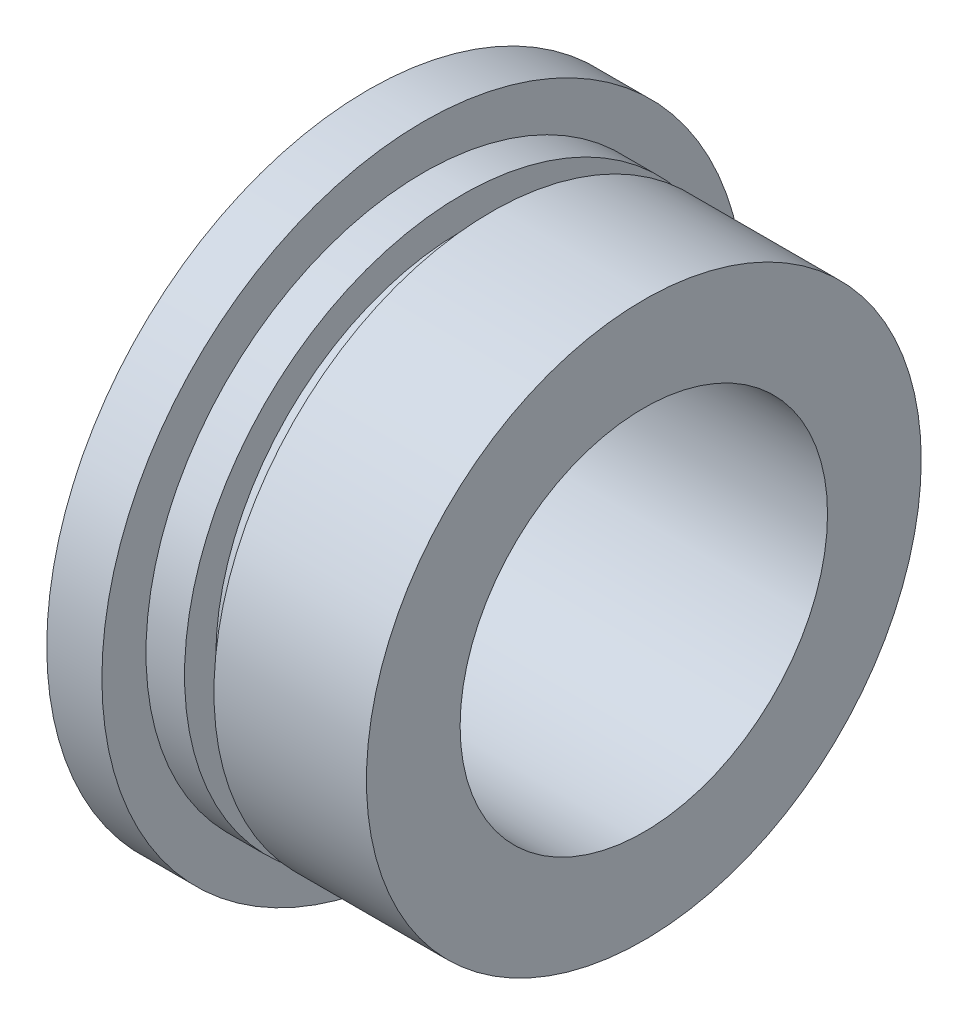
ISO-10303-21;
HEADER;
FILE_DESCRIPTION(('STEP AP214'),'2;1');
FILE_NAME('part.step','',(''),(''),'','','');
FILE_SCHEMA(('AUTOMOTIVE_DESIGN { 1 0 10303 214 1 1 1 1 }'));
ENDSEC;
DATA;
#1=APPLICATION_CONTEXT('core data for automotive mechanical design processes');
#2=APPLICATION_PROTOCOL_DEFINITION('international standard','automotive_design',2000,#1);
#3=PRODUCT_CONTEXT('',#1,'mechanical');
#4=PRODUCT('Part','Part','',(#3));
#5=PRODUCT_RELATED_PRODUCT_CATEGORY('part','',(#4));
#6=PRODUCT_DEFINITION_FORMATION('','',#4);
#7=PRODUCT_DEFINITION_CONTEXT('part definition',#1,'design');
#8=PRODUCT_DEFINITION('design','',#6,#7);
#9=PRODUCT_DEFINITION_SHAPE('','',#8);
#10=(LENGTH_UNIT() NAMED_UNIT(*) SI_UNIT(.MILLI.,.METRE.));
#11=(NAMED_UNIT(*) PLANE_ANGLE_UNIT() SI_UNIT($,.RADIAN.));
#12=(NAMED_UNIT(*) SI_UNIT($,.STERADIAN.) SOLID_ANGLE_UNIT());
#13=UNCERTAINTY_MEASURE_WITH_UNIT(LENGTH_MEASURE(1.E-05),#10,'distance_accuracy_value','');
#14=(GEOMETRIC_REPRESENTATION_CONTEXT(3) GLOBAL_UNCERTAINTY_ASSIGNED_CONTEXT((#13)) GLOBAL_UNIT_ASSIGNED_CONTEXT((#10,
#11,#12)) REPRESENTATION_CONTEXT('',''));
#15=CARTESIAN_POINT('',(0.,0.,0.));
#16=DIRECTION('',(0.,0.,1.));
#17=DIRECTION('',(1.,0.,0.));
#18=AXIS2_PLACEMENT_3D('',#15,#16,#17);
#19=CARTESIAN_POINT('',(-37.9793621207083,37.0852016621459,0.));
#20=DIRECTION('',(-1.,0.,0.));
#21=DIRECTION('',(0.,0.,1.));
#22=AXIS2_PLACEMENT_3D('',#19,#20,#21);
#23=PLANE('',#22);
#24=CARTESIAN_POINT('',(-37.9793621207083,54.5852016621459,0.));
#25=DIRECTION('',(1.,0.,0.));
#26=DIRECTION('',(0.,0.,-1.));
#27=AXIS2_PLACEMENT_3D('',#24,#25,#26);
#28=CIRCLE('',#27,15.1);
#29=CARTESIAN_POINT('',(-37.9793621207083,54.5852016621459,-15.1));
#30=VERTEX_POINT('',#29);
#31=EDGE_CURVE('E12',#30,#30,#28,.T.);
#32=ORIENTED_EDGE('',*,*,#31,.F.);
#33=EDGE_LOOP('',(#32));
#34=FACE_BOUND('',#33,.T.);
#35=CARTESIAN_POINT('',(-37.9793621207083,54.5852016621459,0.));
#36=DIRECTION('',(1.,0.,0.));
#37=DIRECTION('',(0.,0.,-1.));
#38=AXIS2_PLACEMENT_3D('',#35,#36,#37);
#39=CIRCLE('',#38,17.5);
#40=CARTESIAN_POINT('',(-37.9793621207083,54.5852016621459,-17.5));
#41=VERTEX_POINT('',#40);
#42=EDGE_CURVE('E74',#41,#41,#39,.T.);
#43=ORIENTED_EDGE('',*,*,#42,.T.);
#44=EDGE_LOOP('',(#43));
#45=FACE_BOUND('',#44,.T.);
#46=ADVANCED_FACE('F40',(#34,#45),#23,.F.);
#47=CARTESIAN_POINT('',(-23.6448828307083,54.5852016621459,0.));
#48=DIRECTION('',(1.,0.,0.));
#49=DIRECTION('',(0.,0.,-1.));
#50=AXIS2_PLACEMENT_3D('',#47,#48,#49);
#51=CYLINDRICAL_SURFACE('',#50,15.1);
#52=CARTESIAN_POINT('',(-35.8793621207083,54.5852016621459,0.));
#53=DIRECTION('',(1.,0.,0.));
#54=DIRECTION('',(0.,0.,-1.));
#55=AXIS2_PLACEMENT_3D('',#52,#53,#54);
#56=CIRCLE('',#55,15.1);
#57=CARTESIAN_POINT('',(-35.8793621207083,54.5852016621459,-15.1));
#58=VERTEX_POINT('',#57);
#59=EDGE_CURVE('E46',#58,#58,#56,.T.);
#60=ORIENTED_EDGE('',*,*,#59,.F.);
#61=EDGE_LOOP('',(#60));
#62=FACE_BOUND('',#61,.T.);
#63=ORIENTED_EDGE('',*,*,#31,.T.);
#64=EDGE_LOOP('',(#63));
#65=FACE_BOUND('',#64,.T.);
#66=ADVANCED_FACE('F123',(#62,#65),#51,.T.);
#67=CARTESIAN_POINT('',(-35.8793621207083,41.1852016621459,0.));
#68=DIRECTION('',(-1.,0.,0.));
#69=DIRECTION('',(0.,0.,1.));
#70=AXIS2_PLACEMENT_3D('',#67,#68,#69);
#71=PLANE('',#70);
#72=CARTESIAN_POINT('',(-35.8793621207083,54.5852016621459,0.));
#73=DIRECTION('',(1.,0.,0.));
#74=DIRECTION('',(0.,0.,-1.));
#75=AXIS2_PLACEMENT_3D('',#72,#73,#74);
#76=CIRCLE('',#75,13.4);
#77=CARTESIAN_POINT('',(-35.8793621207083,54.5852016621459,-13.4));
#78=VERTEX_POINT('',#77);
#79=EDGE_CURVE('E50',#78,#78,#76,.T.);
#80=ORIENTED_EDGE('',*,*,#79,.F.);
#81=EDGE_LOOP('',(#80));
#82=FACE_BOUND('',#81,.T.);
#83=ORIENTED_EDGE('',*,*,#59,.T.);
#84=EDGE_LOOP('',(#83));
#85=FACE_BOUND('',#84,.T.);
#86=ADVANCED_FACE('F118',(#82,#85),#71,.F.);
#87=CARTESIAN_POINT('',(-23.6448828307083,54.5852016621459,0.));
#88=DIRECTION('',(1.,0.,0.));
#89=DIRECTION('',(0.,0.,-1.));
#90=AXIS2_PLACEMENT_3D('',#87,#88,#89);
#91=CYLINDRICAL_SURFACE('',#90,13.4);
#92=CARTESIAN_POINT('',(-34.2793621207083,54.5852016621459,0.));
#93=DIRECTION('',(1.,0.,0.));
#94=DIRECTION('',(0.,0.,-1.));
#95=AXIS2_PLACEMENT_3D('',#92,#93,#94);
#96=CIRCLE('',#95,13.4);
#97=CARTESIAN_POINT('',(-34.2793621207083,54.5852016621459,-13.4));
#98=VERTEX_POINT('',#97);
#99=EDGE_CURVE('E54',#98,#98,#96,.T.);
#100=ORIENTED_EDGE('',*,*,#99,.F.);
#101=EDGE_LOOP('',(#100));
#102=FACE_BOUND('',#101,.T.);
#103=ORIENTED_EDGE('',*,*,#79,.T.);
#104=EDGE_LOOP('',(#103));
#105=FACE_BOUND('',#104,.T.);
#106=ADVANCED_FACE('F112',(#102,#105),#91,.T.);
#107=CARTESIAN_POINT('',(-34.2793621207083,41.1852016621459,0.));
#108=DIRECTION('',(1.,0.,0.));
#109=DIRECTION('',(0.,0.,-1.));
#110=AXIS2_PLACEMENT_3D('',#107,#108,#109);
#111=PLANE('',#110);
#112=CARTESIAN_POINT('',(-34.2793621207083,54.5852016621459,0.));
#113=DIRECTION('',(1.,0.,0.));
#114=DIRECTION('',(0.,0.,-1.));
#115=AXIS2_PLACEMENT_3D('',#112,#113,#114);
#116=CIRCLE('',#115,15.1);
#117=CARTESIAN_POINT('',(-34.2793621207083,54.5852016621459,-15.1));
#118=VERTEX_POINT('',#117);
#119=EDGE_CURVE('E59',#118,#118,#116,.T.);
#120=ORIENTED_EDGE('',*,*,#119,.F.);
#121=EDGE_LOOP('',(#120));
#122=FACE_BOUND('',#121,.T.);
#123=ORIENTED_EDGE('',*,*,#99,.T.);
#124=EDGE_LOOP('',(#123));
#125=FACE_BOUND('',#124,.T.);
#126=ADVANCED_FACE('F106',(#122,#125),#111,.F.);
#127=CARTESIAN_POINT('',(-23.6448828307083,54.5852016621459,0.));
#128=DIRECTION('',(1.,0.,0.));
#129=DIRECTION('',(0.,0.,-1.));
#130=AXIS2_PLACEMENT_3D('',#127,#128,#129);
#131=CYLINDRICAL_SURFACE('',#130,15.1);
#132=CARTESIAN_POINT('',(-25.9793621207083,54.5852016621459,0.));
#133=DIRECTION('',(1.,0.,0.));
#134=DIRECTION('',(0.,0.,-1.));
#135=AXIS2_PLACEMENT_3D('',#132,#133,#134);
#136=CIRCLE('',#135,15.1);
#137=CARTESIAN_POINT('',(-25.9793621207083,54.5852016621459,-15.1));
#138=VERTEX_POINT('',#137);
#139=EDGE_CURVE('E62',#138,#138,#136,.T.);
#140=ORIENTED_EDGE('',*,*,#139,.F.);
#141=EDGE_LOOP('',(#140));
#142=FACE_BOUND('',#141,.T.);
#143=ORIENTED_EDGE('',*,*,#119,.T.);
#144=EDGE_LOOP('',(#143));
#145=FACE_BOUND('',#144,.T.);
#146=ADVANCED_FACE('F100',(#142,#145),#131,.T.);
#147=CARTESIAN_POINT('',(-25.9793621207083,39.4852016621459,0.));
#148=DIRECTION('',(-1.,0.,0.));
#149=DIRECTION('',(0.,0.,1.));
#150=AXIS2_PLACEMENT_3D('',#147,#148,#149);
#151=PLANE('',#150);
#152=CARTESIAN_POINT('',(-25.9793621207083,54.5852016621459,0.));
#153=DIRECTION('',(1.,0.,0.));
#154=DIRECTION('',(0.,0.,-1.));
#155=AXIS2_PLACEMENT_3D('',#152,#153,#154);
#156=CIRCLE('',#155,10.);
#157=CARTESIAN_POINT('',(-25.9793621207083,54.5852016621459,-10.));
#158=VERTEX_POINT('',#157);
#159=EDGE_CURVE('E65',#158,#158,#156,.T.);
#160=ORIENTED_EDGE('',*,*,#159,.F.);
#161=EDGE_LOOP('',(#160));
#162=FACE_BOUND('',#161,.T.);
#163=ORIENTED_EDGE('',*,*,#139,.T.);
#164=EDGE_LOOP('',(#163));
#165=FACE_BOUND('',#164,.T.);
#166=ADVANCED_FACE('F94',(#162,#165),#151,.F.);
#167=CARTESIAN_POINT('',(-23.6448828307083,54.5852016621459,0.));
#168=DIRECTION('',(1.,0.,0.));
#169=DIRECTION('',(0.,0.,-1.));
#170=AXIS2_PLACEMENT_3D('',#167,#168,#169);
#171=CYLINDRICAL_SURFACE('',#170,10.);
#172=CARTESIAN_POINT('',(-40.9793621207083,54.5852016621459,0.));
#173=DIRECTION('',(1.,0.,0.));
#174=DIRECTION('',(0.,0.,-1.));
#175=AXIS2_PLACEMENT_3D('',#172,#173,#174);
#176=CIRCLE('',#175,9.99999999999999);
#177=CARTESIAN_POINT('',(-40.9793621207083,54.5852016621459,-9.99999999999999));
#178=VERTEX_POINT('',#177);
#179=EDGE_CURVE('E68',#178,#178,#176,.T.);
#180=ORIENTED_EDGE('',*,*,#179,.F.);
#181=EDGE_LOOP('',(#180));
#182=FACE_BOUND('',#181,.T.);
#183=ORIENTED_EDGE('',*,*,#159,.T.);
#184=EDGE_LOOP('',(#183));
#185=FACE_BOUND('',#184,.T.);
#186=ADVANCED_FACE('F88',(#182,#185),#171,.F.);
#187=CARTESIAN_POINT('',(-40.9793621207083,37.0852016621459,0.));
#188=DIRECTION('',(1.,0.,0.));
#189=DIRECTION('',(0.,0.,-1.));
#190=AXIS2_PLACEMENT_3D('',#187,#188,#189);
#191=PLANE('',#190);
#192=CARTESIAN_POINT('',(-40.9793621207083,54.5852016621459,0.));
#193=DIRECTION('',(1.,0.,0.));
#194=DIRECTION('',(0.,0.,-1.));
#195=AXIS2_PLACEMENT_3D('',#192,#193,#194);
#196=CIRCLE('',#195,17.5);
#197=CARTESIAN_POINT('',(-40.9793621207083,54.5852016621459,-17.5));
#198=VERTEX_POINT('',#197);
#199=EDGE_CURVE('E71',#198,#198,#196,.T.);
#200=ORIENTED_EDGE('',*,*,#199,.F.);
#201=EDGE_LOOP('',(#200));
#202=FACE_BOUND('',#201,.T.);
#203=ORIENTED_EDGE('',*,*,#179,.T.);
#204=EDGE_LOOP('',(#203));
#205=FACE_BOUND('',#204,.T.);
#206=ADVANCED_FACE('F82',(#202,#205),#191,.F.);
#207=CARTESIAN_POINT('',(-23.6448828307083,54.5852016621459,0.));
#208=DIRECTION('',(1.,0.,0.));
#209=DIRECTION('',(0.,0.,-1.));
#210=AXIS2_PLACEMENT_3D('',#207,#208,#209);
#211=CYLINDRICAL_SURFACE('',#210,17.5);
#212=ORIENTED_EDGE('',*,*,#42,.F.);
#213=EDGE_LOOP('',(#212));
#214=FACE_BOUND('',#213,.T.);
#215=ORIENTED_EDGE('',*,*,#199,.T.);
#216=EDGE_LOOP('',(#215));
#217=FACE_BOUND('',#216,.T.);
#218=ADVANCED_FACE('F79',(#214,#217),#211,.T.);
#219=CLOSED_SHELL('',(#46,#66,#86,#106,#126,#146,#166,#186,#206,#218));
#220=MANIFOLD_SOLID_BREP('B2',#219);
#221=ADVANCED_BREP_SHAPE_REPRESENTATION('',(#18,#220),#14);
#222=SHAPE_DEFINITION_REPRESENTATION(#9,#221);
ENDSEC;
END-ISO-10303-21;
